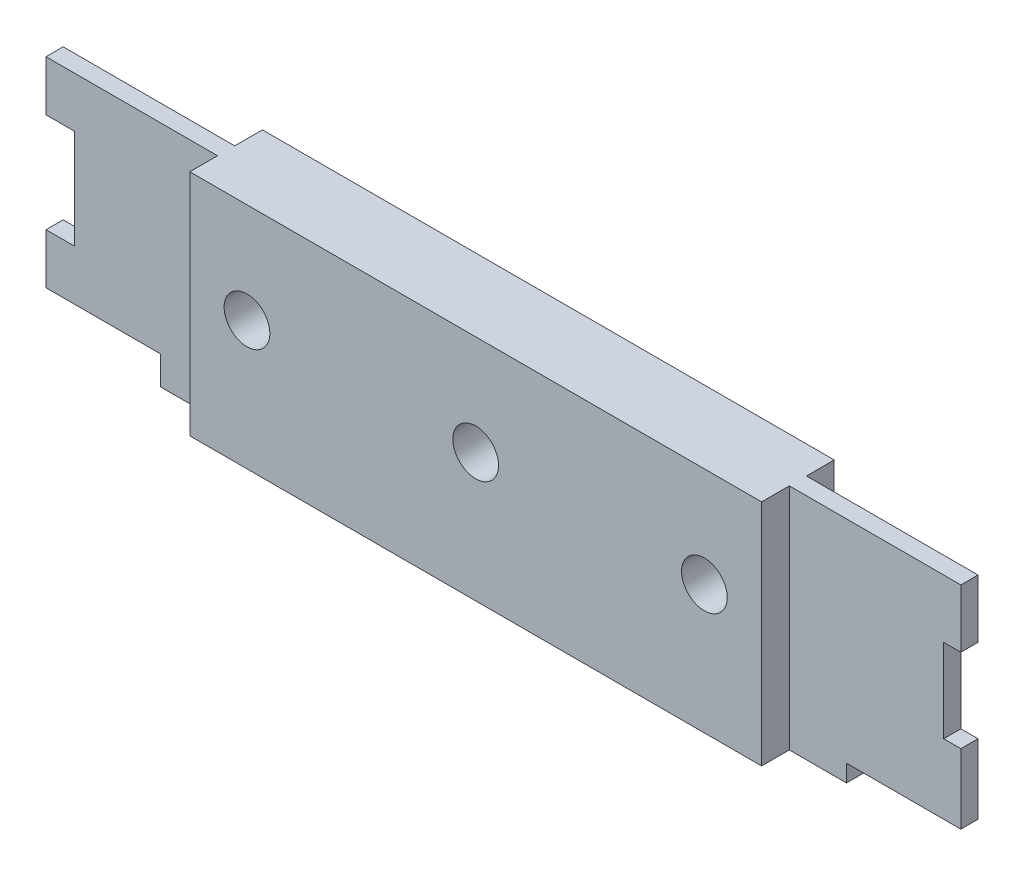
ISO-10303-21;
HEADER;
FILE_DESCRIPTION(('STEP AP214'),'2;1');
FILE_NAME('part.step','',(''),(''),'','','');
FILE_SCHEMA(('AUTOMOTIVE_DESIGN { 1 0 10303 214 1 1 1 1 }'));
ENDSEC;
DATA;
#1=APPLICATION_CONTEXT('core data for automotive mechanical design processes');
#2=APPLICATION_PROTOCOL_DEFINITION('international standard','automotive_design',2000,#1);
#3=PRODUCT_CONTEXT('',#1,'mechanical');
#4=PRODUCT('Part','Part','',(#3));
#5=PRODUCT_RELATED_PRODUCT_CATEGORY('part','',(#4));
#6=PRODUCT_DEFINITION_FORMATION('','',#4);
#7=PRODUCT_DEFINITION_CONTEXT('part definition',#1,'design');
#8=PRODUCT_DEFINITION('design','',#6,#7);
#9=PRODUCT_DEFINITION_SHAPE('','',#8);
#10=(LENGTH_UNIT() NAMED_UNIT(*) SI_UNIT(.MILLI.,.METRE.));
#11=(NAMED_UNIT(*) PLANE_ANGLE_UNIT() SI_UNIT($,.RADIAN.));
#12=(NAMED_UNIT(*) SI_UNIT($,.STERADIAN.) SOLID_ANGLE_UNIT());
#13=UNCERTAINTY_MEASURE_WITH_UNIT(LENGTH_MEASURE(1.E-05),#10,'distance_accuracy_value','');
#14=(GEOMETRIC_REPRESENTATION_CONTEXT(3) GLOBAL_UNCERTAINTY_ASSIGNED_CONTEXT((#13)) GLOBAL_UNIT_ASSIGNED_CONTEXT((#10,
#11,#12)) REPRESENTATION_CONTEXT('',''));
#15=CARTESIAN_POINT('',(0.,0.,0.));
#16=DIRECTION('',(0.,0.,1.));
#17=DIRECTION('',(1.,0.,0.));
#18=AXIS2_PLACEMENT_3D('',#15,#16,#17);
#19=CARTESIAN_POINT('',(0.,0.,0.75));
#20=DIRECTION('',(0.,0.,-1.));
#21=DIRECTION('',(-1.,0.,0.));
#22=AXIS2_PLACEMENT_3D('',#19,#20,#21);
#23=PLANE('',#22);
#24=DIRECTION('',(0.,-1.,0.));
#25=VECTOR('',#24,1.);
#26=CARTESIAN_POINT('',(-25.0000000000001,0.,0.75));
#27=LINE('',#26,#25);
#28=CARTESIAN_POINT('',(-25.0000000000001,8.74999999999999,0.75));
#29=VERTEX_POINT('',#28);
#30=CARTESIAN_POINT('',(-25.0000000000001,-11.25,0.75));
#31=VERTEX_POINT('',#30);
#32=EDGE_CURVE('E218',#29,#31,#27,.T.);
#33=ORIENTED_EDGE('',*,*,#32,.F.);
#34=DIRECTION('',(-1.,0.,0.));
#35=VECTOR('',#34,1.);
#36=CARTESIAN_POINT('',(-40.0000000000001,8.74999999999999,0.75));
#37=LINE('',#36,#35);
#38=CARTESIAN_POINT('',(-40.0000000000001,8.74999999999999,0.75));
#39=VERTEX_POINT('',#38);
#40=EDGE_CURVE('E265',#29,#39,#37,.T.);
#41=ORIENTED_EDGE('',*,*,#40,.T.);
#42=DIRECTION('',(0.,-1.,0.));
#43=VECTOR('',#42,1.);
#44=CARTESIAN_POINT('',(-40.,4.34999999999999,0.75));
#45=LINE('',#44,#43);
#46=CARTESIAN_POINT('',(-40.,4.34999999999999,0.75));
#47=VERTEX_POINT('',#46);
#48=EDGE_CURVE('E233',#39,#47,#45,.T.);
#49=ORIENTED_EDGE('',*,*,#48,.T.);
#50=DIRECTION('',(1.,0.,0.));
#51=VECTOR('',#50,1.);
#52=CARTESIAN_POINT('',(-37.5,4.34999999999999,0.75));
#53=LINE('',#52,#51);
#54=CARTESIAN_POINT('',(-37.5,4.34999999999999,0.75));
#55=VERTEX_POINT('',#54);
#56=EDGE_CURVE('E236',#47,#55,#53,.T.);
#57=ORIENTED_EDGE('',*,*,#56,.T.);
#58=DIRECTION('',(0.,-1.,0.));
#59=VECTOR('',#58,1.);
#60=CARTESIAN_POINT('',(-37.5,-4.35,0.75));
#61=LINE('',#60,#59);
#62=CARTESIAN_POINT('',(-37.5,-4.35,0.75));
#63=VERTEX_POINT('',#62);
#64=EDGE_CURVE('E239',#55,#63,#61,.T.);
#65=ORIENTED_EDGE('',*,*,#64,.T.);
#66=DIRECTION('',(-1.,0.,0.));
#67=VECTOR('',#66,1.);
#68=CARTESIAN_POINT('',(-40.,-4.35,0.75));
#69=LINE('',#68,#67);
#70=CARTESIAN_POINT('',(-40.,-4.35,0.75));
#71=VERTEX_POINT('',#70);
#72=EDGE_CURVE('E241',#63,#71,#69,.T.);
#73=ORIENTED_EDGE('',*,*,#72,.T.);
#74=DIRECTION('',(0.,-1.,0.));
#75=VECTOR('',#74,1.);
#76=CARTESIAN_POINT('',(-40.,-8.75000000000001,0.75));
#77=LINE('',#76,#75);
#78=CARTESIAN_POINT('',(-40.,-8.75000000000001,0.75));
#79=VERTEX_POINT('',#78);
#80=EDGE_CURVE('E243',#71,#79,#77,.T.);
#81=ORIENTED_EDGE('',*,*,#80,.T.);
#82=DIRECTION('',(1.,0.,0.));
#83=VECTOR('',#82,1.);
#84=CARTESIAN_POINT('',(-30.,-8.75,0.75));
#85=LINE('',#84,#83);
#86=CARTESIAN_POINT('',(-30.,-8.75,0.75));
#87=VERTEX_POINT('',#86);
#88=EDGE_CURVE('E245',#79,#87,#85,.T.);
#89=ORIENTED_EDGE('',*,*,#88,.T.);
#90=DIRECTION('',(0.,-1.,0.));
#91=VECTOR('',#90,1.);
#92=CARTESIAN_POINT('',(-30.,-11.25,0.75));
#93=LINE('',#92,#91);
#94=CARTESIAN_POINT('',(-30.,-11.25,0.75));
#95=VERTEX_POINT('',#94);
#96=EDGE_CURVE('E247',#87,#95,#93,.T.);
#97=ORIENTED_EDGE('',*,*,#96,.T.);
#98=DIRECTION('',(1.,0.,0.));
#99=VECTOR('',#98,1.);
#100=CARTESIAN_POINT('',(30.,-11.25,0.75));
#101=LINE('',#100,#99);
#102=EDGE_CURVE('E56',#95,#31,#101,.T.);
#103=ORIENTED_EDGE('',*,*,#102,.T.);
#104=EDGE_LOOP('',(#33,#41,#49,#57,#65,#73,#81,#89,#97,#103));
#105=FACE_BOUND('',#104,.T.);
#106=ADVANCED_FACE('F33',(#105),#23,.F.);
#107=DIRECTION('',(0.,1.,0.));
#108=VECTOR('',#107,1.);
#109=CARTESIAN_POINT('',(25.,0.,0.75));
#110=LINE('',#109,#108);
#111=CARTESIAN_POINT('',(25.,-11.25,0.75));
#112=VERTEX_POINT('',#111);
#113=CARTESIAN_POINT('',(25.,8.74999999999999,0.75));
#114=VERTEX_POINT('',#113);
#115=EDGE_CURVE('E48',#112,#114,#110,.T.);
#116=ORIENTED_EDGE('',*,*,#115,.F.);
#117=CARTESIAN_POINT('',(30.,-11.25,0.75));
#118=VERTEX_POINT('',#117);
#119=EDGE_CURVE('E249',#112,#118,#101,.T.);
#120=ORIENTED_EDGE('',*,*,#119,.T.);
#121=DIRECTION('',(0.,1.,0.));
#122=VECTOR('',#121,1.);
#123=CARTESIAN_POINT('',(30.,-9.74999999999999,0.75));
#124=LINE('',#123,#122);
#125=CARTESIAN_POINT('',(30.,-9.74999999999999,0.75));
#126=VERTEX_POINT('',#125);
#127=EDGE_CURVE('E251',#118,#126,#124,.T.);
#128=ORIENTED_EDGE('',*,*,#127,.T.);
#129=DIRECTION('',(1.,0.,0.));
#130=VECTOR('',#129,1.);
#131=CARTESIAN_POINT('',(40.,-9.74999999999999,0.75));
#132=LINE('',#131,#130);
#133=CARTESIAN_POINT('',(40.,-9.74999999999999,0.75));
#134=VERTEX_POINT('',#133);
#135=EDGE_CURVE('E253',#126,#134,#132,.T.);
#136=ORIENTED_EDGE('',*,*,#135,.T.);
#137=DIRECTION('',(0.,1.,0.));
#138=VECTOR('',#137,1.);
#139=CARTESIAN_POINT('',(40.,-3.65,0.75));
#140=LINE('',#139,#138);
#141=CARTESIAN_POINT('',(40.,-3.65,0.75));
#142=VERTEX_POINT('',#141);
#143=EDGE_CURVE('E255',#134,#142,#140,.T.);
#144=ORIENTED_EDGE('',*,*,#143,.T.);
#145=DIRECTION('',(-1.,0.,0.));
#146=VECTOR('',#145,1.);
#147=CARTESIAN_POINT('',(38.5,-3.65,0.75));
#148=LINE('',#147,#146);
#149=CARTESIAN_POINT('',(38.5,-3.65,0.75));
#150=VERTEX_POINT('',#149);
#151=EDGE_CURVE('E257',#142,#150,#148,.T.);
#152=ORIENTED_EDGE('',*,*,#151,.T.);
#153=DIRECTION('',(0.,1.,0.));
#154=VECTOR('',#153,1.);
#155=CARTESIAN_POINT('',(38.5,3.65,0.75));
#156=LINE('',#155,#154);
#157=CARTESIAN_POINT('',(38.5,3.65,0.75));
#158=VERTEX_POINT('',#157);
#159=EDGE_CURVE('E259',#150,#158,#156,.T.);
#160=ORIENTED_EDGE('',*,*,#159,.T.);
#161=DIRECTION('',(1.,0.,0.));
#162=VECTOR('',#161,1.);
#163=CARTESIAN_POINT('',(40.,3.65,0.75));
#164=LINE('',#163,#162);
#165=CARTESIAN_POINT('',(40.,3.65,0.75));
#166=VERTEX_POINT('',#165);
#167=EDGE_CURVE('E261',#158,#166,#164,.T.);
#168=ORIENTED_EDGE('',*,*,#167,.T.);
#169=DIRECTION('',(0.,1.,0.));
#170=VECTOR('',#169,1.);
#171=CARTESIAN_POINT('',(40.0000000000001,8.74999999999999,0.75));
#172=LINE('',#171,#170);
#173=CARTESIAN_POINT('',(40.0000000000001,8.74999999999999,0.75));
#174=VERTEX_POINT('',#173);
#175=EDGE_CURVE('E263',#166,#174,#172,.T.);
#176=ORIENTED_EDGE('',*,*,#175,.T.);
#177=EDGE_CURVE('E266',#174,#114,#37,.T.);
#178=ORIENTED_EDGE('',*,*,#177,.T.);
#179=EDGE_LOOP('',(#116,#120,#128,#136,#144,#152,#160,#168,#176,#178));
#180=FACE_BOUND('',#179,.T.);
#181=ADVANCED_FACE('F429',(#180),#23,.F.);
#182=CARTESIAN_POINT('',(0.,0.,-0.75));
#183=DIRECTION('',(0.,0.,-1.));
#184=DIRECTION('',(-1.,0.,0.));
#185=AXIS2_PLACEMENT_3D('',#182,#183,#184);
#186=PLANE('',#185);
#187=DIRECTION('',(-1.,0.,0.));
#188=VECTOR('',#187,1.);
#189=CARTESIAN_POINT('',(-40.0000000000001,8.74999999999999,-0.75));
#190=LINE('',#189,#188);
#191=CARTESIAN_POINT('',(-25.0000000000001,8.74999999999999,-0.75));
#192=VERTEX_POINT('',#191);
#193=CARTESIAN_POINT('',(-40.0000000000001,8.74999999999999,-0.75));
#194=VERTEX_POINT('',#193);
#195=EDGE_CURVE('E301',#192,#194,#190,.T.);
#196=ORIENTED_EDGE('',*,*,#195,.F.);
#197=DIRECTION('',(0.,-1.,0.));
#198=VECTOR('',#197,1.);
#199=CARTESIAN_POINT('',(-25.0000000000001,0.,-0.75));
#200=LINE('',#199,#198);
#201=CARTESIAN_POINT('',(-25.0000000000001,-11.25,-0.75));
#202=VERTEX_POINT('',#201);
#203=EDGE_CURVE('E228',#192,#202,#200,.T.);
#204=ORIENTED_EDGE('',*,*,#203,.T.);
#205=DIRECTION('',(1.,0.,0.));
#206=VECTOR('',#205,1.);
#207=CARTESIAN_POINT('',(30.,-11.25,-0.75));
#208=LINE('',#207,#206);
#209=CARTESIAN_POINT('',(-30.,-11.25,-0.75));
#210=VERTEX_POINT('',#209);
#211=EDGE_CURVE('E284',#210,#202,#208,.T.);
#212=ORIENTED_EDGE('',*,*,#211,.F.);
#213=DIRECTION('',(0.,-1.,0.));
#214=VECTOR('',#213,1.);
#215=CARTESIAN_POINT('',(-30.,-11.25,-0.75));
#216=LINE('',#215,#214);
#217=CARTESIAN_POINT('',(-30.,-8.75,-0.75));
#218=VERTEX_POINT('',#217);
#219=EDGE_CURVE('E281',#218,#210,#216,.T.);
#220=ORIENTED_EDGE('',*,*,#219,.F.);
#221=DIRECTION('',(1.,0.,0.));
#222=VECTOR('',#221,1.);
#223=CARTESIAN_POINT('',(-30.,-8.75,-0.75));
#224=LINE('',#223,#222);
#225=CARTESIAN_POINT('',(-40.,-8.75000000000001,-0.75));
#226=VERTEX_POINT('',#225);
#227=EDGE_CURVE('E279',#226,#218,#224,.T.);
#228=ORIENTED_EDGE('',*,*,#227,.F.);
#229=DIRECTION('',(0.,-1.,0.));
#230=VECTOR('',#229,1.);
#231=CARTESIAN_POINT('',(-40.,-8.75000000000001,-0.75));
#232=LINE('',#231,#230);
#233=CARTESIAN_POINT('',(-40.,-4.35,-0.75));
#234=VERTEX_POINT('',#233);
#235=EDGE_CURVE('E277',#234,#226,#232,.T.);
#236=ORIENTED_EDGE('',*,*,#235,.F.);
#237=DIRECTION('',(-1.,0.,0.));
#238=VECTOR('',#237,1.);
#239=CARTESIAN_POINT('',(-40.,-4.35,-0.75));
#240=LINE('',#239,#238);
#241=CARTESIAN_POINT('',(-37.5,-4.35,-0.75));
#242=VERTEX_POINT('',#241);
#243=EDGE_CURVE('E275',#242,#234,#240,.T.);
#244=ORIENTED_EDGE('',*,*,#243,.F.);
#245=DIRECTION('',(0.,-1.,0.));
#246=VECTOR('',#245,1.);
#247=CARTESIAN_POINT('',(-37.5,-4.35,-0.75));
#248=LINE('',#247,#246);
#249=CARTESIAN_POINT('',(-37.5,4.34999999999999,-0.75));
#250=VERTEX_POINT('',#249);
#251=EDGE_CURVE('E273',#250,#242,#248,.T.);
#252=ORIENTED_EDGE('',*,*,#251,.F.);
#253=DIRECTION('',(1.,0.,0.));
#254=VECTOR('',#253,1.);
#255=CARTESIAN_POINT('',(-37.5,4.34999999999999,-0.75));
#256=LINE('',#255,#254);
#257=CARTESIAN_POINT('',(-40.,4.34999999999999,-0.75));
#258=VERTEX_POINT('',#257);
#259=EDGE_CURVE('E271',#258,#250,#256,.T.);
#260=ORIENTED_EDGE('',*,*,#259,.F.);
#261=DIRECTION('',(0.,-1.,0.));
#262=VECTOR('',#261,1.);
#263=CARTESIAN_POINT('',(-40.,4.34999999999999,-0.75));
#264=LINE('',#263,#262);
#265=EDGE_CURVE('E232',#194,#258,#264,.T.);
#266=ORIENTED_EDGE('',*,*,#265,.F.);
#267=EDGE_LOOP('',(#196,#204,#212,#220,#228,#236,#244,#252,#260,#266));
#268=FACE_BOUND('',#267,.T.);
#269=ADVANCED_FACE('F355',(#268),#186,.T.);
#270=CARTESIAN_POINT('',(25.,-11.25,-0.75));
#271=VERTEX_POINT('',#270);
#272=CARTESIAN_POINT('',(30.,-11.25,-0.75));
#273=VERTEX_POINT('',#272);
#274=EDGE_CURVE('E283',#271,#273,#208,.T.);
#275=ORIENTED_EDGE('',*,*,#274,.F.);
#276=DIRECTION('',(0.,1.,0.));
#277=VECTOR('',#276,1.);
#278=CARTESIAN_POINT('',(25.,0.,-0.75));
#279=LINE('',#278,#277);
#280=CARTESIAN_POINT('',(25.,8.74999999999999,-0.75));
#281=VERTEX_POINT('',#280);
#282=EDGE_CURVE('E219',#271,#281,#279,.T.);
#283=ORIENTED_EDGE('',*,*,#282,.T.);
#284=CARTESIAN_POINT('',(40.0000000000001,8.74999999999999,-0.75));
#285=VERTEX_POINT('',#284);
#286=EDGE_CURVE('E237',#285,#281,#190,.T.);
#287=ORIENTED_EDGE('',*,*,#286,.F.);
#288=DIRECTION('',(0.,1.,0.));
#289=VECTOR('',#288,1.);
#290=CARTESIAN_POINT('',(40.0000000000001,8.74999999999999,-0.75));
#291=LINE('',#290,#289);
#292=CARTESIAN_POINT('',(40.,3.65,-0.75));
#293=VERTEX_POINT('',#292);
#294=EDGE_CURVE('E299',#293,#285,#291,.T.);
#295=ORIENTED_EDGE('',*,*,#294,.F.);
#296=DIRECTION('',(1.,0.,0.));
#297=VECTOR('',#296,1.);
#298=CARTESIAN_POINT('',(40.,3.65,-0.75));
#299=LINE('',#298,#297);
#300=CARTESIAN_POINT('',(38.5,3.65,-0.75));
#301=VERTEX_POINT('',#300);
#302=EDGE_CURVE('E297',#301,#293,#299,.T.);
#303=ORIENTED_EDGE('',*,*,#302,.F.);
#304=DIRECTION('',(0.,1.,0.));
#305=VECTOR('',#304,1.);
#306=CARTESIAN_POINT('',(38.5,3.65,-0.75));
#307=LINE('',#306,#305);
#308=CARTESIAN_POINT('',(38.5,-3.65,-0.75));
#309=VERTEX_POINT('',#308);
#310=EDGE_CURVE('E295',#309,#301,#307,.T.);
#311=ORIENTED_EDGE('',*,*,#310,.F.);
#312=DIRECTION('',(-1.,0.,0.));
#313=VECTOR('',#312,1.);
#314=CARTESIAN_POINT('',(38.5,-3.65,-0.75));
#315=LINE('',#314,#313);
#316=CARTESIAN_POINT('',(40.,-3.65,-0.75));
#317=VERTEX_POINT('',#316);
#318=EDGE_CURVE('E293',#317,#309,#315,.T.);
#319=ORIENTED_EDGE('',*,*,#318,.F.);
#320=DIRECTION('',(0.,1.,0.));
#321=VECTOR('',#320,1.);
#322=CARTESIAN_POINT('',(40.,-3.65,-0.75));
#323=LINE('',#322,#321);
#324=CARTESIAN_POINT('',(40.,-9.74999999999999,-0.75));
#325=VERTEX_POINT('',#324);
#326=EDGE_CURVE('E291',#325,#317,#323,.T.);
#327=ORIENTED_EDGE('',*,*,#326,.F.);
#328=DIRECTION('',(1.,0.,0.));
#329=VECTOR('',#328,1.);
#330=CARTESIAN_POINT('',(40.,-9.74999999999999,-0.75));
#331=LINE('',#330,#329);
#332=CARTESIAN_POINT('',(30.,-9.74999999999999,-0.75));
#333=VERTEX_POINT('',#332);
#334=EDGE_CURVE('E289',#333,#325,#331,.T.);
#335=ORIENTED_EDGE('',*,*,#334,.F.);
#336=DIRECTION('',(0.,1.,0.));
#337=VECTOR('',#336,1.);
#338=CARTESIAN_POINT('',(30.,-9.74999999999999,-0.75));
#339=LINE('',#338,#337);
#340=EDGE_CURVE('E287',#273,#333,#339,.T.);
#341=ORIENTED_EDGE('',*,*,#340,.F.);
#342=EDGE_LOOP('',(#275,#283,#287,#295,#303,#311,#319,#327,#335,#341));
#343=FACE_BOUND('',#342,.T.);
#344=ADVANCED_FACE('F417',(#343),#186,.T.);
#345=CARTESIAN_POINT('',(-40.,4.34999999999999,0.75));
#346=DIRECTION('',(1.,0.,0.));
#347=DIRECTION('',(0.,1.,0.));
#348=AXIS2_PLACEMENT_3D('',#345,#346,#347);
#349=PLANE('',#348);
#350=ORIENTED_EDGE('',*,*,#265,.T.);
#351=DIRECTION('',(0.,0.,-1.));
#352=VECTOR('',#351,1.);
#353=CARTESIAN_POINT('',(-40.,4.34999999999999,0.75));
#354=LINE('',#353,#352);
#355=EDGE_CURVE('E11',#47,#258,#354,.T.);
#356=ORIENTED_EDGE('',*,*,#355,.F.);
#357=ORIENTED_EDGE('',*,*,#48,.F.);
#358=DIRECTION('',(0.,0.,-1.));
#359=VECTOR('',#358,1.);
#360=CARTESIAN_POINT('',(-40.0000000000001,8.74999999999999,0.75));
#361=LINE('',#360,#359);
#362=EDGE_CURVE('E268',#39,#194,#361,.T.);
#363=ORIENTED_EDGE('',*,*,#362,.T.);
#364=EDGE_LOOP('',(#350,#356,#357,#363));
#365=FACE_BOUND('',#364,.T.);
#366=ADVANCED_FACE('F35',(#365),#349,.F.);
#367=CARTESIAN_POINT('',(-37.5,4.34999999999999,0.75));
#368=DIRECTION('',(0.,1.,0.));
#369=DIRECTION('',(-1.,0.,0.));
#370=AXIS2_PLACEMENT_3D('',#367,#368,#369);
#371=PLANE('',#370);
#372=ORIENTED_EDGE('',*,*,#259,.T.);
#373=DIRECTION('',(0.,0.,-1.));
#374=VECTOR('',#373,1.);
#375=CARTESIAN_POINT('',(-37.5,4.34999999999999,0.75));
#376=LINE('',#375,#374);
#377=EDGE_CURVE('E41',#55,#250,#376,.T.);
#378=ORIENTED_EDGE('',*,*,#377,.F.);
#379=ORIENTED_EDGE('',*,*,#56,.F.);
#380=ORIENTED_EDGE('',*,*,#355,.T.);
#381=EDGE_LOOP('',(#372,#378,#379,#380));
#382=FACE_BOUND('',#381,.T.);
#383=ADVANCED_FACE('F371',(#382),#371,.F.);
#384=CARTESIAN_POINT('',(-37.5,-4.35,0.75));
#385=DIRECTION('',(1.,0.,0.));
#386=DIRECTION('',(0.,1.,0.));
#387=AXIS2_PLACEMENT_3D('',#384,#385,#386);
#388=PLANE('',#387);
#389=ORIENTED_EDGE('',*,*,#251,.T.);
#390=DIRECTION('',(0.,0.,-1.));
#391=VECTOR('',#390,1.);
#392=CARTESIAN_POINT('',(-37.5,-4.35,0.75));
#393=LINE('',#392,#391);
#394=EDGE_CURVE('E342',#63,#242,#393,.T.);
#395=ORIENTED_EDGE('',*,*,#394,.F.);
#396=ORIENTED_EDGE('',*,*,#64,.F.);
#397=ORIENTED_EDGE('',*,*,#377,.T.);
#398=EDGE_LOOP('',(#389,#395,#396,#397));
#399=FACE_BOUND('',#398,.T.);
#400=ADVANCED_FACE('F349',(#399),#388,.F.);
#401=CARTESIAN_POINT('',(-40.,-4.35,0.75));
#402=DIRECTION('',(0.,-1.,0.));
#403=DIRECTION('',(0.,0.,-1.));
#404=AXIS2_PLACEMENT_3D('',#401,#402,#403);
#405=PLANE('',#404);
#406=ORIENTED_EDGE('',*,*,#243,.T.);
#407=DIRECTION('',(0.,0.,-1.));
#408=VECTOR('',#407,1.);
#409=CARTESIAN_POINT('',(-40.,-4.35,0.75));
#410=LINE('',#409,#408);
#411=EDGE_CURVE('E339',#71,#234,#410,.T.);
#412=ORIENTED_EDGE('',*,*,#411,.F.);
#413=ORIENTED_EDGE('',*,*,#72,.F.);
#414=ORIENTED_EDGE('',*,*,#394,.T.);
#415=EDGE_LOOP('',(#406,#412,#413,#414));
#416=FACE_BOUND('',#415,.T.);
#417=ADVANCED_FACE('F361',(#416),#405,.F.);
#418=CARTESIAN_POINT('',(-40.,-8.75000000000001,0.75));
#419=DIRECTION('',(1.,0.,0.));
#420=DIRECTION('',(0.,1.,0.));
#421=AXIS2_PLACEMENT_3D('',#418,#419,#420);
#422=PLANE('',#421);
#423=ORIENTED_EDGE('',*,*,#235,.T.);
#424=DIRECTION('',(0.,0.,-1.));
#425=VECTOR('',#424,1.);
#426=CARTESIAN_POINT('',(-40.,-8.75000000000001,0.75));
#427=LINE('',#426,#425);
#428=EDGE_CURVE('E336',#79,#226,#427,.T.);
#429=ORIENTED_EDGE('',*,*,#428,.F.);
#430=ORIENTED_EDGE('',*,*,#80,.F.);
#431=ORIENTED_EDGE('',*,*,#411,.T.);
#432=EDGE_LOOP('',(#423,#429,#430,#431));
#433=FACE_BOUND('',#432,.T.);
#434=ADVANCED_FACE('F365',(#433),#422,.F.);
#435=CARTESIAN_POINT('',(-30.,-8.75,0.75));
#436=DIRECTION('',(0.,1.,0.));
#437=DIRECTION('',(-1.,0.,0.));
#438=AXIS2_PLACEMENT_3D('',#435,#436,#437);
#439=PLANE('',#438);
#440=ORIENTED_EDGE('',*,*,#227,.T.);
#441=DIRECTION('',(0.,0.,-1.));
#442=VECTOR('',#441,1.);
#443=CARTESIAN_POINT('',(-30.,-8.75,0.75));
#444=LINE('',#443,#442);
#445=EDGE_CURVE('E333',#87,#218,#444,.T.);
#446=ORIENTED_EDGE('',*,*,#445,.F.);
#447=ORIENTED_EDGE('',*,*,#88,.F.);
#448=ORIENTED_EDGE('',*,*,#428,.T.);
#449=EDGE_LOOP('',(#440,#446,#447,#448));
#450=FACE_BOUND('',#449,.T.);
#451=ADVANCED_FACE('F505',(#450),#439,.F.);
#452=CARTESIAN_POINT('',(-30.,-11.25,0.75));
#453=DIRECTION('',(1.,0.,0.));
#454=DIRECTION('',(0.,1.,0.));
#455=AXIS2_PLACEMENT_3D('',#452,#453,#454);
#456=PLANE('',#455);
#457=ORIENTED_EDGE('',*,*,#219,.T.);
#458=DIRECTION('',(0.,0.,-1.));
#459=VECTOR('',#458,1.);
#460=CARTESIAN_POINT('',(-30.,-11.25,0.75));
#461=LINE('',#460,#459);
#462=EDGE_CURVE('E330',#95,#210,#461,.T.);
#463=ORIENTED_EDGE('',*,*,#462,.F.);
#464=ORIENTED_EDGE('',*,*,#96,.F.);
#465=ORIENTED_EDGE('',*,*,#445,.T.);
#466=EDGE_LOOP('',(#457,#463,#464,#465));
#467=FACE_BOUND('',#466,.T.);
#468=ADVANCED_FACE('F502',(#467),#456,.F.);
#469=CARTESIAN_POINT('',(30.,-11.25,0.75));
#470=DIRECTION('',(0.,1.,0.));
#471=DIRECTION('',(-1.,0.,0.));
#472=AXIS2_PLACEMENT_3D('',#469,#470,#471);
#473=PLANE('',#472);
#474=ORIENTED_EDGE('',*,*,#119,.F.);
#475=DIRECTION('',(0.,0.,-1.));
#476=VECTOR('',#475,1.);
#477=CARTESIAN_POINT('',(25.,-11.25,3.175));
#478=LINE('',#477,#476);
#479=CARTESIAN_POINT('',(25.,-11.25,3.175));
#480=VERTEX_POINT('',#479);
#481=EDGE_CURVE('E201',#480,#112,#478,.T.);
#482=ORIENTED_EDGE('',*,*,#481,.F.);
#483=DIRECTION('',(1.,0.,0.));
#484=VECTOR('',#483,1.);
#485=CARTESIAN_POINT('',(-25.0000000000001,-11.25,3.175));
#486=LINE('',#485,#484);
#487=CARTESIAN_POINT('',(-25.0000000000001,-11.25,3.175));
#488=VERTEX_POINT('',#487);
#489=EDGE_CURVE('E195',#488,#480,#486,.T.);
#490=ORIENTED_EDGE('',*,*,#489,.F.);
#491=DIRECTION('',(0.,0.,-1.));
#492=VECTOR('',#491,1.);
#493=CARTESIAN_POINT('',(-25.0000000000001,-11.25,3.175));
#494=LINE('',#493,#492);
#495=EDGE_CURVE('E199',#488,#31,#494,.T.);
#496=ORIENTED_EDGE('',*,*,#495,.T.);
#497=ORIENTED_EDGE('',*,*,#102,.F.);
#498=ORIENTED_EDGE('',*,*,#462,.T.);
#499=ORIENTED_EDGE('',*,*,#211,.T.);
#500=CARTESIAN_POINT('',(-25.0000000000001,-11.25,-3.175));
#501=VERTEX_POINT('',#500);
#502=EDGE_CURVE('E220',#202,#501,#494,.T.);
#503=ORIENTED_EDGE('',*,*,#502,.T.);
#504=DIRECTION('',(1.,0.,0.));
#505=VECTOR('',#504,1.);
#506=CARTESIAN_POINT('',(-25.0000000000001,-11.25,-3.175));
#507=LINE('',#506,#505);
#508=CARTESIAN_POINT('',(25.,-11.25,-3.175));
#509=VERTEX_POINT('',#508);
#510=EDGE_CURVE('E391',#501,#509,#507,.T.);
#511=ORIENTED_EDGE('',*,*,#510,.T.);
#512=EDGE_CURVE('E407',#271,#509,#478,.T.);
#513=ORIENTED_EDGE('',*,*,#512,.F.);
#514=ORIENTED_EDGE('',*,*,#274,.T.);
#515=DIRECTION('',(0.,0.,-1.));
#516=VECTOR('',#515,1.);
#517=CARTESIAN_POINT('',(30.,-11.25,0.75));
#518=LINE('',#517,#516);
#519=EDGE_CURVE('E327',#118,#273,#518,.T.);
#520=ORIENTED_EDGE('',*,*,#519,.F.);
#521=EDGE_LOOP('',(#474,#482,#490,#496,#497,#498,#499,#503,#511,#513,#514,#520));
#522=FACE_BOUND('',#521,.T.);
#523=ADVANCED_FACE('F197',(#522),#473,.F.);
#524=CARTESIAN_POINT('',(30.,-9.74999999999999,0.75));
#525=DIRECTION('',(-1.,0.,0.));
#526=DIRECTION('',(0.,0.,1.));
#527=AXIS2_PLACEMENT_3D('',#524,#525,#526);
#528=PLANE('',#527);
#529=ORIENTED_EDGE('',*,*,#340,.T.);
#530=DIRECTION('',(0.,0.,-1.));
#531=VECTOR('',#530,1.);
#532=CARTESIAN_POINT('',(30.,-9.74999999999999,0.75));
#533=LINE('',#532,#531);
#534=EDGE_CURVE('E324',#126,#333,#533,.T.);
#535=ORIENTED_EDGE('',*,*,#534,.F.);
#536=ORIENTED_EDGE('',*,*,#127,.F.);
#537=ORIENTED_EDGE('',*,*,#519,.T.);
#538=EDGE_LOOP('',(#529,#535,#536,#537));
#539=FACE_BOUND('',#538,.T.);
#540=ADVANCED_FACE('F422',(#539),#528,.F.);
#541=CARTESIAN_POINT('',(40.,-9.74999999999999,0.75));
#542=DIRECTION('',(0.,1.,0.));
#543=DIRECTION('',(-1.,0.,0.));
#544=AXIS2_PLACEMENT_3D('',#541,#542,#543);
#545=PLANE('',#544);
#546=ORIENTED_EDGE('',*,*,#334,.T.);
#547=DIRECTION('',(0.,0.,-1.));
#548=VECTOR('',#547,1.);
#549=CARTESIAN_POINT('',(40.,-9.74999999999999,0.75));
#550=LINE('',#549,#548);
#551=EDGE_CURVE('E321',#134,#325,#550,.T.);
#552=ORIENTED_EDGE('',*,*,#551,.F.);
#553=ORIENTED_EDGE('',*,*,#135,.F.);
#554=ORIENTED_EDGE('',*,*,#534,.T.);
#555=EDGE_LOOP('',(#546,#552,#553,#554));
#556=FACE_BOUND('',#555,.T.);
#557=ADVANCED_FACE('F426',(#556),#545,.F.);
#558=CARTESIAN_POINT('',(40.,-3.65,0.75));
#559=DIRECTION('',(-1.,0.,0.));
#560=DIRECTION('',(0.,0.,1.));
#561=AXIS2_PLACEMENT_3D('',#558,#559,#560);
#562=PLANE('',#561);
#563=ORIENTED_EDGE('',*,*,#326,.T.);
#564=DIRECTION('',(0.,0.,-1.));
#565=VECTOR('',#564,1.);
#566=CARTESIAN_POINT('',(40.,-3.65,0.75));
#567=LINE('',#566,#565);
#568=EDGE_CURVE('E318',#142,#317,#567,.T.);
#569=ORIENTED_EDGE('',*,*,#568,.F.);
#570=ORIENTED_EDGE('',*,*,#143,.F.);
#571=ORIENTED_EDGE('',*,*,#551,.T.);
#572=EDGE_LOOP('',(#563,#569,#570,#571));
#573=FACE_BOUND('',#572,.T.);
#574=ADVANCED_FACE('F491',(#573),#562,.F.);
#575=CARTESIAN_POINT('',(38.5,-3.65,0.75));
#576=DIRECTION('',(0.,-1.,0.));
#577=DIRECTION('',(1.,0.,0.));
#578=AXIS2_PLACEMENT_3D('',#575,#576,#577);
#579=PLANE('',#578);
#580=ORIENTED_EDGE('',*,*,#318,.T.);
#581=DIRECTION('',(0.,0.,-1.));
#582=VECTOR('',#581,1.);
#583=CARTESIAN_POINT('',(38.5,-3.65,0.75));
#584=LINE('',#583,#582);
#585=EDGE_CURVE('E315',#150,#309,#584,.T.);
#586=ORIENTED_EDGE('',*,*,#585,.F.);
#587=ORIENTED_EDGE('',*,*,#151,.F.);
#588=ORIENTED_EDGE('',*,*,#568,.T.);
#589=EDGE_LOOP('',(#580,#586,#587,#588));
#590=FACE_BOUND('',#589,.T.);
#591=ADVANCED_FACE('F487',(#590),#579,.F.);
#592=CARTESIAN_POINT('',(38.5,3.65,0.75));
#593=DIRECTION('',(-1.,0.,0.));
#594=DIRECTION('',(0.,0.,1.));
#595=AXIS2_PLACEMENT_3D('',#592,#593,#594);
#596=PLANE('',#595);
#597=ORIENTED_EDGE('',*,*,#310,.T.);
#598=DIRECTION('',(0.,0.,-1.));
#599=VECTOR('',#598,1.);
#600=CARTESIAN_POINT('',(38.5,3.65,0.75));
#601=LINE('',#600,#599);
#602=EDGE_CURVE('E312',#158,#301,#601,.T.);
#603=ORIENTED_EDGE('',*,*,#602,.F.);
#604=ORIENTED_EDGE('',*,*,#159,.F.);
#605=ORIENTED_EDGE('',*,*,#585,.T.);
#606=EDGE_LOOP('',(#597,#603,#604,#605));
#607=FACE_BOUND('',#606,.T.);
#608=ADVANCED_FACE('F483',(#607),#596,.F.);
#609=CARTESIAN_POINT('',(40.,3.65,0.75));
#610=DIRECTION('',(0.,1.,0.));
#611=DIRECTION('',(-1.,0.,0.));
#612=AXIS2_PLACEMENT_3D('',#609,#610,#611);
#613=PLANE('',#612);
#614=ORIENTED_EDGE('',*,*,#302,.T.);
#615=DIRECTION('',(0.,0.,-1.));
#616=VECTOR('',#615,1.);
#617=CARTESIAN_POINT('',(40.,3.65,0.75));
#618=LINE('',#617,#616);
#619=EDGE_CURVE('E309',#166,#293,#618,.T.);
#620=ORIENTED_EDGE('',*,*,#619,.F.);
#621=ORIENTED_EDGE('',*,*,#167,.F.);
#622=ORIENTED_EDGE('',*,*,#602,.T.);
#623=EDGE_LOOP('',(#614,#620,#621,#622));
#624=FACE_BOUND('',#623,.T.);
#625=ADVANCED_FACE('F479',(#624),#613,.F.);
#626=CARTESIAN_POINT('',(40.0000000000001,8.74999999999999,0.75));
#627=DIRECTION('',(-1.,0.,0.));
#628=DIRECTION('',(0.,-1.,0.));
#629=AXIS2_PLACEMENT_3D('',#626,#627,#628);
#630=PLANE('',#629);
#631=ORIENTED_EDGE('',*,*,#294,.T.);
#632=DIRECTION('',(0.,0.,-1.));
#633=VECTOR('',#632,1.);
#634=CARTESIAN_POINT('',(40.0000000000001,8.74999999999999,0.75));
#635=LINE('',#634,#633);
#636=EDGE_CURVE('E306',#174,#285,#635,.T.);
#637=ORIENTED_EDGE('',*,*,#636,.F.);
#638=ORIENTED_EDGE('',*,*,#175,.F.);
#639=ORIENTED_EDGE('',*,*,#619,.T.);
#640=EDGE_LOOP('',(#631,#637,#638,#639));
#641=FACE_BOUND('',#640,.T.);
#642=ADVANCED_FACE('F476',(#641),#630,.F.);
#643=CARTESIAN_POINT('',(-40.0000000000001,8.74999999999999,0.75));
#644=DIRECTION('',(0.,-1.,0.));
#645=DIRECTION('',(0.,0.,-1.));
#646=AXIS2_PLACEMENT_3D('',#643,#644,#645);
#647=PLANE('',#646);
#648=ORIENTED_EDGE('',*,*,#286,.T.);
#649=DIRECTION('',(0.,0.,-1.));
#650=VECTOR('',#649,1.);
#651=CARTESIAN_POINT('',(25.,8.74999999999999,3.175));
#652=LINE('',#651,#650);
#653=CARTESIAN_POINT('',(25.,8.74999999999999,-3.175));
#654=VERTEX_POINT('',#653);
#655=EDGE_CURVE('E404',#281,#654,#652,.T.);
#656=ORIENTED_EDGE('',*,*,#655,.T.);
#657=DIRECTION('',(-1.,0.,0.));
#658=VECTOR('',#657,1.);
#659=CARTESIAN_POINT('',(-25.0000000000001,8.74999999999999,-3.175));
#660=LINE('',#659,#658);
#661=CARTESIAN_POINT('',(-25.0000000000001,8.74999999999999,-3.175));
#662=VERTEX_POINT('',#661);
#663=EDGE_CURVE('E215',#654,#662,#660,.T.);
#664=ORIENTED_EDGE('',*,*,#663,.T.);
#665=DIRECTION('',(0.,0.,-1.));
#666=VECTOR('',#665,1.);
#667=CARTESIAN_POINT('',(-25.0000000000001,8.74999999999999,3.175));
#668=LINE('',#667,#666);
#669=EDGE_CURVE('E379',#192,#662,#668,.T.);
#670=ORIENTED_EDGE('',*,*,#669,.F.);
#671=ORIENTED_EDGE('',*,*,#195,.T.);
#672=ORIENTED_EDGE('',*,*,#362,.F.);
#673=ORIENTED_EDGE('',*,*,#40,.F.);
#674=CARTESIAN_POINT('',(-25.0000000000001,8.74999999999999,3.175));
#675=VERTEX_POINT('',#674);
#676=EDGE_CURVE('E384',#675,#29,#668,.T.);
#677=ORIENTED_EDGE('',*,*,#676,.F.);
#678=DIRECTION('',(-1.,0.,0.));
#679=VECTOR('',#678,1.);
#680=CARTESIAN_POINT('',(-25.0000000000001,8.74999999999999,3.175));
#681=LINE('',#680,#679);
#682=CARTESIAN_POINT('',(25.,8.74999999999999,3.175));
#683=VERTEX_POINT('',#682);
#684=EDGE_CURVE('E211',#683,#675,#681,.T.);
#685=ORIENTED_EDGE('',*,*,#684,.F.);
#686=EDGE_CURVE('E405',#683,#114,#652,.T.);
#687=ORIENTED_EDGE('',*,*,#686,.T.);
#688=ORIENTED_EDGE('',*,*,#177,.F.);
#689=ORIENTED_EDGE('',*,*,#636,.T.);
#690=EDGE_LOOP('',(#648,#656,#664,#670,#671,#672,#673,#677,#685,#687,#688,#689));
#691=FACE_BOUND('',#690,.T.);
#692=ADVANCED_FACE('F377',(#691),#647,.F.);
#693=CARTESIAN_POINT('',(25.,8.74999999999999,3.175));
#694=DIRECTION('',(-1.,0.,0.));
#695=DIRECTION('',(0.,0.,1.));
#696=AXIS2_PLACEMENT_3D('',#693,#694,#695);
#697=PLANE('',#696);
#698=ORIENTED_EDGE('',*,*,#282,.F.);
#699=ORIENTED_EDGE('',*,*,#512,.T.);
#700=DIRECTION('',(0.,1.,0.));
#701=VECTOR('',#700,1.);
#702=CARTESIAN_POINT('',(25.,8.74999999999999,-3.175));
#703=LINE('',#702,#701);
#704=EDGE_CURVE('E397',#509,#654,#703,.T.);
#705=ORIENTED_EDGE('',*,*,#704,.T.);
#706=ORIENTED_EDGE('',*,*,#655,.F.);
#707=EDGE_LOOP('',(#698,#699,#705,#706));
#708=FACE_BOUND('',#707,.T.);
#709=ADVANCED_FACE('F412',(#708),#697,.F.);
#710=CARTESIAN_POINT('',(-25.0000000000001,8.74999999999999,3.175));
#711=DIRECTION('',(1.,0.,0.));
#712=DIRECTION('',(0.,1.,0.));
#713=AXIS2_PLACEMENT_3D('',#710,#711,#712);
#714=PLANE('',#713);
#715=ORIENTED_EDGE('',*,*,#203,.F.);
#716=ORIENTED_EDGE('',*,*,#669,.T.);
#717=DIRECTION('',(0.,-1.,0.));
#718=VECTOR('',#717,1.);
#719=CARTESIAN_POINT('',(-25.0000000000001,8.74999999999999,-3.175));
#720=LINE('',#719,#718);
#721=EDGE_CURVE('E387',#662,#501,#720,.T.);
#722=ORIENTED_EDGE('',*,*,#721,.T.);
#723=ORIENTED_EDGE('',*,*,#502,.F.);
#724=EDGE_LOOP('',(#715,#716,#722,#723));
#725=FACE_BOUND('',#724,.T.);
#726=ADVANCED_FACE('F386',(#725),#714,.F.);
#727=CARTESIAN_POINT('',(0.,0.,-3.175));
#728=DIRECTION('',(0.,0.,1.));
#729=DIRECTION('',(1.,0.,0.));
#730=AXIS2_PLACEMENT_3D('',#727,#728,#729);
#731=PLANE('',#730);
#732=ORIENTED_EDGE('',*,*,#721,.F.);
#733=ORIENTED_EDGE('',*,*,#663,.F.);
#734=ORIENTED_EDGE('',*,*,#704,.F.);
#735=ORIENTED_EDGE('',*,*,#510,.F.);
#736=EDGE_LOOP('',(#732,#733,#734,#735));
#737=FACE_BOUND('',#736,.T.);
#738=CARTESIAN_POINT('',(-20.,0.,-3.175));
#739=DIRECTION('',(0.,0.,1.));
#740=DIRECTION('',(1.,0.,0.));
#741=AXIS2_PLACEMENT_3D('',#738,#739,#740);
#742=CIRCLE('',#741,2.00000000000003);
#743=CARTESIAN_POINT('',(-18.,0.,-3.175));
#744=VERTEX_POINT('',#743);
#745=EDGE_CURVE('E435',#744,#744,#742,.T.);
#746=ORIENTED_EDGE('',*,*,#745,.T.);
#747=EDGE_LOOP('',(#746));
#748=FACE_BOUND('',#747,.T.);
#749=CARTESIAN_POINT('',(0.,0.,-3.175));
#750=DIRECTION('',(0.,0.,1.));
#751=DIRECTION('',(1.,0.,0.));
#752=AXIS2_PLACEMENT_3D('',#749,#750,#751);
#753=CIRCLE('',#752,2.00000000000002);
#754=CARTESIAN_POINT('',(2.00000000000002,0.,-3.175));
#755=VERTEX_POINT('',#754);
#756=EDGE_CURVE('E441',#755,#755,#753,.T.);
#757=ORIENTED_EDGE('',*,*,#756,.T.);
#758=EDGE_LOOP('',(#757));
#759=FACE_BOUND('',#758,.T.);
#760=CARTESIAN_POINT('',(20.,0.,-3.175));
#761=DIRECTION('',(0.,0.,1.));
#762=DIRECTION('',(1.,0.,0.));
#763=AXIS2_PLACEMENT_3D('',#760,#761,#762);
#764=CIRCLE('',#763,2.00000000000003);
#765=CARTESIAN_POINT('',(22.,0.,-3.175));
#766=VERTEX_POINT('',#765);
#767=EDGE_CURVE('E447',#766,#766,#764,.T.);
#768=ORIENTED_EDGE('',*,*,#767,.T.);
#769=EDGE_LOOP('',(#768));
#770=FACE_BOUND('',#769,.T.);
#771=ADVANCED_FACE('F394',(#737,#748,#759,#770),#731,.F.);
#772=CARTESIAN_POINT('',(20.,0.,0.75));
#773=DIRECTION('',(0.,0.,-1.));
#774=DIRECTION('',(-1.,0.,0.));
#775=AXIS2_PLACEMENT_3D('',#772,#773,#774);
#776=CYLINDRICAL_SURFACE('',#775,2.00000000000003);
#777=ORIENTED_EDGE('',*,*,#767,.F.);
#778=EDGE_LOOP('',(#777));
#779=FACE_BOUND('',#778,.T.);
#780=CARTESIAN_POINT('',(20.,0.,3.175));
#781=DIRECTION('',(0.,0.,1.));
#782=DIRECTION('',(1.,0.,0.));
#783=AXIS2_PLACEMENT_3D('',#780,#781,#782);
#784=CIRCLE('',#783,2.00000000000003);
#785=CARTESIAN_POINT('',(22.,0.,3.175));
#786=VERTEX_POINT('',#785);
#787=EDGE_CURVE('E444',#786,#786,#784,.T.);
#788=ORIENTED_EDGE('',*,*,#787,.T.);
#789=EDGE_LOOP('',(#788));
#790=FACE_BOUND('',#789,.T.);
#791=ADVANCED_FACE('F453',(#779,#790),#776,.F.);
#792=CARTESIAN_POINT('',(0.,0.,0.75));
#793=DIRECTION('',(0.,0.,-1.));
#794=DIRECTION('',(-1.,0.,0.));
#795=AXIS2_PLACEMENT_3D('',#792,#793,#794);
#796=CYLINDRICAL_SURFACE('',#795,2.00000000000002);
#797=ORIENTED_EDGE('',*,*,#756,.F.);
#798=EDGE_LOOP('',(#797));
#799=FACE_BOUND('',#798,.T.);
#800=CARTESIAN_POINT('',(0.,0.,3.175));
#801=DIRECTION('',(0.,0.,1.));
#802=DIRECTION('',(1.,0.,0.));
#803=AXIS2_PLACEMENT_3D('',#800,#801,#802);
#804=CIRCLE('',#803,2.00000000000002);
#805=CARTESIAN_POINT('',(2.00000000000002,0.,3.175));
#806=VERTEX_POINT('',#805);
#807=EDGE_CURVE('E438',#806,#806,#804,.T.);
#808=ORIENTED_EDGE('',*,*,#807,.T.);
#809=EDGE_LOOP('',(#808));
#810=FACE_BOUND('',#809,.T.);
#811=ADVANCED_FACE('F661',(#799,#810),#796,.F.);
#812=CARTESIAN_POINT('',(-20.,0.,0.75));
#813=DIRECTION('',(0.,0.,-1.));
#814=DIRECTION('',(-1.,0.,0.));
#815=AXIS2_PLACEMENT_3D('',#812,#813,#814);
#816=CYLINDRICAL_SURFACE('',#815,2.00000000000003);
#817=ORIENTED_EDGE('',*,*,#745,.F.);
#818=EDGE_LOOP('',(#817));
#819=FACE_BOUND('',#818,.T.);
#820=CARTESIAN_POINT('',(-20.,0.,3.175));
#821=DIRECTION('',(0.,0.,1.));
#822=DIRECTION('',(1.,0.,0.));
#823=AXIS2_PLACEMENT_3D('',#820,#821,#822);
#824=CIRCLE('',#823,2.00000000000003);
#825=CARTESIAN_POINT('',(-18.,0.,3.175));
#826=VERTEX_POINT('',#825);
#827=EDGE_CURVE('E400',#826,#826,#824,.T.);
#828=ORIENTED_EDGE('',*,*,#827,.T.);
#829=EDGE_LOOP('',(#828));
#830=FACE_BOUND('',#829,.T.);
#831=ADVANCED_FACE('F671',(#819,#830),#816,.F.);
#832=ORIENTED_EDGE('',*,*,#676,.T.);
#833=ORIENTED_EDGE('',*,*,#32,.T.);
#834=ORIENTED_EDGE('',*,*,#495,.F.);
#835=DIRECTION('',(0.,-1.,0.));
#836=VECTOR('',#835,1.);
#837=CARTESIAN_POINT('',(-25.0000000000001,8.74999999999999,3.175));
#838=LINE('',#837,#836);
#839=EDGE_CURVE('E205',#675,#488,#838,.T.);
#840=ORIENTED_EDGE('',*,*,#839,.F.);
#841=EDGE_LOOP('',(#832,#833,#834,#840));
#842=FACE_BOUND('',#841,.T.);
#843=ADVANCED_FACE('F217',(#842),#714,.F.);
#844=ORIENTED_EDGE('',*,*,#481,.T.);
#845=ORIENTED_EDGE('',*,*,#115,.T.);
#846=ORIENTED_EDGE('',*,*,#686,.F.);
#847=DIRECTION('',(0.,1.,0.));
#848=VECTOR('',#847,1.);
#849=CARTESIAN_POINT('',(25.,8.74999999999999,3.175));
#850=LINE('',#849,#848);
#851=EDGE_CURVE('E204',#480,#683,#850,.T.);
#852=ORIENTED_EDGE('',*,*,#851,.F.);
#853=EDGE_LOOP('',(#844,#845,#846,#852));
#854=FACE_BOUND('',#853,.T.);
#855=ADVANCED_FACE('F432',(#854),#697,.F.);
#856=CARTESIAN_POINT('',(0.,0.,3.175));
#857=DIRECTION('',(0.,0.,1.));
#858=DIRECTION('',(1.,0.,0.));
#859=AXIS2_PLACEMENT_3D('',#856,#857,#858);
#860=PLANE('',#859);
#861=ORIENTED_EDGE('',*,*,#807,.F.);
#862=EDGE_LOOP('',(#861));
#863=FACE_BOUND('',#862,.T.);
#864=ORIENTED_EDGE('',*,*,#839,.T.);
#865=ORIENTED_EDGE('',*,*,#489,.T.);
#866=ORIENTED_EDGE('',*,*,#851,.T.);
#867=ORIENTED_EDGE('',*,*,#684,.T.);
#868=EDGE_LOOP('',(#864,#865,#866,#867));
#869=FACE_BOUND('',#868,.T.);
#870=ORIENTED_EDGE('',*,*,#827,.F.);
#871=EDGE_LOOP('',(#870));
#872=FACE_BOUND('',#871,.T.);
#873=ORIENTED_EDGE('',*,*,#787,.F.);
#874=EDGE_LOOP('',(#873));
#875=FACE_BOUND('',#874,.T.);
#876=ADVANCED_FACE('F208',(#863,#869,#872,#875),#860,.T.);
#877=CLOSED_SHELL('',(#106,#181,#269,#344,#366,#383,#400,#417,#434,#451,#468,#523,#540,#557,
#574,#591,#608,#625,#642,#692,#709,#726,#771,#791,#811,#831,#843,#855,#876));
#878=MANIFOLD_SOLID_BREP('B2',#877);
#879=ADVANCED_BREP_SHAPE_REPRESENTATION('',(#18,#878),#14);
#880=SHAPE_DEFINITION_REPRESENTATION(#9,#879);
ENDSEC;
END-ISO-10303-21;
